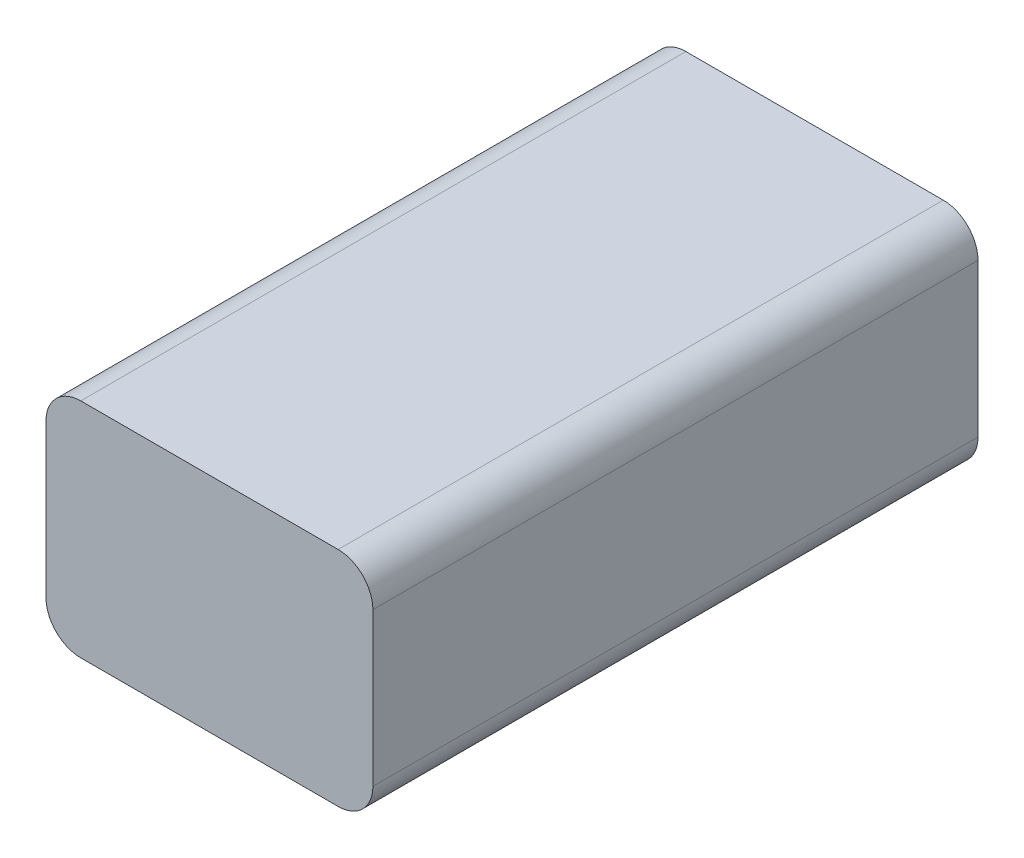
ISO-10303-21;
HEADER;
FILE_DESCRIPTION(('STEP AP214'),'2;1');
FILE_NAME('part.step','',(''),(''),'','','');
FILE_SCHEMA(('AUTOMOTIVE_DESIGN { 1 0 10303 214 1 1 1 1 }'));
ENDSEC;
DATA;
#1=APPLICATION_CONTEXT('core data for automotive mechanical design processes');
#2=APPLICATION_PROTOCOL_DEFINITION('international standard','automotive_design',2000,#1);
#3=PRODUCT_CONTEXT('',#1,'mechanical');
#4=PRODUCT('Part','Part','',(#3));
#5=PRODUCT_RELATED_PRODUCT_CATEGORY('part','',(#4));
#6=PRODUCT_DEFINITION_FORMATION('','',#4);
#7=PRODUCT_DEFINITION_CONTEXT('part definition',#1,'design');
#8=PRODUCT_DEFINITION('design','',#6,#7);
#9=PRODUCT_DEFINITION_SHAPE('','',#8);
#10=(LENGTH_UNIT() NAMED_UNIT(*) SI_UNIT(.MILLI.,.METRE.));
#11=(NAMED_UNIT(*) PLANE_ANGLE_UNIT() SI_UNIT($,.RADIAN.));
#12=(NAMED_UNIT(*) SI_UNIT($,.STERADIAN.) SOLID_ANGLE_UNIT());
#13=UNCERTAINTY_MEASURE_WITH_UNIT(LENGTH_MEASURE(1.E-05),#10,'distance_accuracy_value','');
#14=(GEOMETRIC_REPRESENTATION_CONTEXT(3) GLOBAL_UNCERTAINTY_ASSIGNED_CONTEXT((#13)) GLOBAL_UNIT_ASSIGNED_CONTEXT((#10,
#11,#12)) REPRESENTATION_CONTEXT('',''));
#15=CARTESIAN_POINT('',(0.,0.,0.));
#16=DIRECTION('',(0.,0.,1.));
#17=DIRECTION('',(1.,0.,0.));
#18=AXIS2_PLACEMENT_3D('',#15,#16,#17);
#19=CARTESIAN_POINT('',(-23.5,16.,87.));
#20=DIRECTION('',(1.,0.,0.));
#21=DIRECTION('',(0.,1.,0.));
#22=AXIS2_PLACEMENT_3D('',#19,#20,#21);
#23=PLANE('',#22);
#24=DIRECTION('',(0.,-1.,0.));
#25=VECTOR('',#24,1.);
#26=CARTESIAN_POINT('',(-23.5,16.,0.));
#27=LINE('',#26,#25);
#28=CARTESIAN_POINT('',(-23.5,11.,0.));
#29=VERTEX_POINT('',#28);
#30=CARTESIAN_POINT('',(-23.5,-11.,0.));
#31=VERTEX_POINT('',#30);
#32=EDGE_CURVE('E133',#29,#31,#27,.T.);
#33=ORIENTED_EDGE('',*,*,#32,.T.);
#34=DIRECTION('',(0.,0.,-1.));
#35=VECTOR('',#34,1.);
#36=CARTESIAN_POINT('',(-23.5,-11.,87.));
#37=LINE('',#36,#35);
#38=CARTESIAN_POINT('',(-23.5,-11.,87.));
#39=VERTEX_POINT('',#38);
#40=EDGE_CURVE('E110',#31,#39,#37,.F.);
#41=ORIENTED_EDGE('',*,*,#40,.T.);
#42=DIRECTION('',(0.,-1.,0.));
#43=VECTOR('',#42,1.);
#44=CARTESIAN_POINT('',(-23.5,16.,87.));
#45=LINE('',#44,#43);
#46=CARTESIAN_POINT('',(-23.5,11.,87.));
#47=VERTEX_POINT('',#46);
#48=EDGE_CURVE('E142',#47,#39,#45,.T.);
#49=ORIENTED_EDGE('',*,*,#48,.F.);
#50=DIRECTION('',(0.,0.,-1.));
#51=VECTOR('',#50,1.);
#52=CARTESIAN_POINT('',(-23.5,11.,87.));
#53=LINE('',#52,#51);
#54=EDGE_CURVE('E115',#47,#29,#53,.T.);
#55=ORIENTED_EDGE('',*,*,#54,.T.);
#56=EDGE_LOOP('',(#33,#41,#49,#55));
#57=FACE_BOUND('',#56,.T.);
#58=ADVANCED_FACE('F38',(#57),#23,.F.);
#59=CARTESIAN_POINT('',(23.5,-16.,87.));
#60=DIRECTION('',(0.,1.,0.));
#61=DIRECTION('',(-1.,0.,0.));
#62=AXIS2_PLACEMENT_3D('',#59,#60,#61);
#63=PLANE('',#62);
#64=DIRECTION('',(1.,0.,0.));
#65=VECTOR('',#64,1.);
#66=CARTESIAN_POINT('',(23.5,-16.,87.));
#67=LINE('',#66,#65);
#68=CARTESIAN_POINT('',(-18.5,-16.,87.));
#69=VERTEX_POINT('',#68);
#70=CARTESIAN_POINT('',(18.5,-16.,87.));
#71=VERTEX_POINT('',#70);
#72=EDGE_CURVE('E125',#69,#71,#67,.T.);
#73=ORIENTED_EDGE('',*,*,#72,.F.);
#74=DIRECTION('',(0.,0.,-1.));
#75=VECTOR('',#74,1.);
#76=CARTESIAN_POINT('',(-18.5,-16.,87.));
#77=LINE('',#76,#75);
#78=CARTESIAN_POINT('',(-18.5,-16.,0.));
#79=VERTEX_POINT('',#78);
#80=EDGE_CURVE('E109',#69,#79,#77,.T.);
#81=ORIENTED_EDGE('',*,*,#80,.T.);
#82=DIRECTION('',(1.,0.,0.));
#83=VECTOR('',#82,1.);
#84=CARTESIAN_POINT('',(23.5,-16.,0.));
#85=LINE('',#84,#83);
#86=CARTESIAN_POINT('',(18.5,-16.,0.));
#87=VERTEX_POINT('',#86);
#88=EDGE_CURVE('E122',#79,#87,#85,.T.);
#89=ORIENTED_EDGE('',*,*,#88,.T.);
#90=DIRECTION('',(0.,0.,-1.));
#91=VECTOR('',#90,1.);
#92=CARTESIAN_POINT('',(18.5,-16.,87.));
#93=LINE('',#92,#91);
#94=EDGE_CURVE('E127',#87,#71,#93,.F.);
#95=ORIENTED_EDGE('',*,*,#94,.T.);
#96=EDGE_LOOP('',(#73,#81,#89,#95));
#97=FACE_BOUND('',#96,.T.);
#98=ADVANCED_FACE('F121',(#97),#63,.F.);
#99=CARTESIAN_POINT('',(23.5,16.,87.));
#100=DIRECTION('',(-1.,0.,0.));
#101=DIRECTION('',(0.,-1.,0.));
#102=AXIS2_PLACEMENT_3D('',#99,#100,#101);
#103=PLANE('',#102);
#104=DIRECTION('',(0.,1.,0.));
#105=VECTOR('',#104,1.);
#106=CARTESIAN_POINT('',(23.5,16.,87.));
#107=LINE('',#106,#105);
#108=CARTESIAN_POINT('',(23.5,-11.,87.));
#109=VERTEX_POINT('',#108);
#110=CARTESIAN_POINT('',(23.5,11.,87.));
#111=VERTEX_POINT('',#110);
#112=EDGE_CURVE('E165',#109,#111,#107,.T.);
#113=ORIENTED_EDGE('',*,*,#112,.F.);
#114=DIRECTION('',(0.,0.,-1.));
#115=VECTOR('',#114,1.);
#116=CARTESIAN_POINT('',(23.5,-11.,87.));
#117=LINE('',#116,#115);
#118=CARTESIAN_POINT('',(23.5,-11.,0.));
#119=VERTEX_POINT('',#118);
#120=EDGE_CURVE('E11',#109,#119,#117,.T.);
#121=ORIENTED_EDGE('',*,*,#120,.T.);
#122=DIRECTION('',(0.,1.,0.));
#123=VECTOR('',#122,1.);
#124=CARTESIAN_POINT('',(23.5,16.,0.));
#125=LINE('',#124,#123);
#126=CARTESIAN_POINT('',(23.5,11.,0.));
#127=VERTEX_POINT('',#126);
#128=EDGE_CURVE('E132',#119,#127,#125,.T.);
#129=ORIENTED_EDGE('',*,*,#128,.T.);
#130=DIRECTION('',(0.,0.,-1.));
#131=VECTOR('',#130,1.);
#132=CARTESIAN_POINT('',(23.5,11.,87.));
#133=LINE('',#132,#131);
#134=EDGE_CURVE('E46',#127,#111,#133,.F.);
#135=ORIENTED_EDGE('',*,*,#134,.T.);
#136=EDGE_LOOP('',(#113,#121,#129,#135));
#137=FACE_BOUND('',#136,.T.);
#138=ADVANCED_FACE('F164',(#137),#103,.F.);
#139=CARTESIAN_POINT('',(23.5,16.,87.));
#140=DIRECTION('',(0.,-1.,0.));
#141=DIRECTION('',(1.,0.,0.));
#142=AXIS2_PLACEMENT_3D('',#139,#140,#141);
#143=PLANE('',#142);
#144=DIRECTION('',(-1.,0.,0.));
#145=VECTOR('',#144,1.);
#146=CARTESIAN_POINT('',(23.5,16.,0.));
#147=LINE('',#146,#145);
#148=CARTESIAN_POINT('',(18.5,16.,0.));
#149=VERTEX_POINT('',#148);
#150=CARTESIAN_POINT('',(-18.5,16.,0.));
#151=VERTEX_POINT('',#150);
#152=EDGE_CURVE('E136',#149,#151,#147,.T.);
#153=ORIENTED_EDGE('',*,*,#152,.T.);
#154=DIRECTION('',(0.,0.,-1.));
#155=VECTOR('',#154,1.);
#156=CARTESIAN_POINT('',(-18.5,16.,87.));
#157=LINE('',#156,#155);
#158=CARTESIAN_POINT('',(-18.5,16.,87.));
#159=VERTEX_POINT('',#158);
#160=EDGE_CURVE('E53',#151,#159,#157,.F.);
#161=ORIENTED_EDGE('',*,*,#160,.T.);
#162=DIRECTION('',(-1.,0.,0.));
#163=VECTOR('',#162,1.);
#164=CARTESIAN_POINT('',(23.5,16.,87.));
#165=LINE('',#164,#163);
#166=CARTESIAN_POINT('',(18.5,16.,87.));
#167=VERTEX_POINT('',#166);
#168=EDGE_CURVE('E143',#167,#159,#165,.T.);
#169=ORIENTED_EDGE('',*,*,#168,.F.);
#170=DIRECTION('',(0.,0.,-1.));
#171=VECTOR('',#170,1.);
#172=CARTESIAN_POINT('',(18.5,16.,87.));
#173=LINE('',#172,#171);
#174=EDGE_CURVE('E158',#167,#149,#173,.T.);
#175=ORIENTED_EDGE('',*,*,#174,.T.);
#176=EDGE_LOOP('',(#153,#161,#169,#175));
#177=FACE_BOUND('',#176,.T.);
#178=ADVANCED_FACE('F174',(#177),#143,.F.);
#179=CARTESIAN_POINT('',(0.,0.,87.));
#180=DIRECTION('',(0.,0.,-1.));
#181=DIRECTION('',(-1.,0.,0.));
#182=AXIS2_PLACEMENT_3D('',#179,#180,#181);
#183=PLANE('',#182);
#184=ORIENTED_EDGE('',*,*,#48,.T.);
#185=CARTESIAN_POINT('',(-18.5,-11.,87.));
#186=DIRECTION('',(0.,0.,-1.));
#187=DIRECTION('',(-1.,0.,0.));
#188=AXIS2_PLACEMENT_3D('',#185,#186,#187);
#189=CIRCLE('',#188,5.);
#190=EDGE_CURVE('E156',#39,#69,#189,.F.);
#191=ORIENTED_EDGE('',*,*,#190,.T.);
#192=ORIENTED_EDGE('',*,*,#72,.T.);
#193=CARTESIAN_POINT('',(18.5,-11.,87.));
#194=DIRECTION('',(0.,0.,-1.));
#195=DIRECTION('',(-1.,0.,0.));
#196=AXIS2_PLACEMENT_3D('',#193,#194,#195);
#197=CIRCLE('',#196,5.);
#198=EDGE_CURVE('E152',#71,#109,#197,.F.);
#199=ORIENTED_EDGE('',*,*,#198,.T.);
#200=ORIENTED_EDGE('',*,*,#112,.T.);
#201=CARTESIAN_POINT('',(18.5,11.,87.));
#202=DIRECTION('',(0.,0.,-1.));
#203=DIRECTION('',(-1.,0.,0.));
#204=AXIS2_PLACEMENT_3D('',#201,#202,#203);
#205=CIRCLE('',#204,5.);
#206=EDGE_CURVE('E60',#111,#167,#205,.F.);
#207=ORIENTED_EDGE('',*,*,#206,.T.);
#208=ORIENTED_EDGE('',*,*,#168,.T.);
#209=CARTESIAN_POINT('',(-18.5,11.,87.));
#210=DIRECTION('',(0.,0.,-1.));
#211=DIRECTION('',(-1.,0.,0.));
#212=AXIS2_PLACEMENT_3D('',#209,#210,#211);
#213=CIRCLE('',#212,5.);
#214=EDGE_CURVE('E154',#159,#47,#213,.F.);
#215=ORIENTED_EDGE('',*,*,#214,.T.);
#216=EDGE_LOOP('',(#184,#191,#192,#199,#200,#207,#208,#215));
#217=FACE_BOUND('',#216,.T.);
#218=ADVANCED_FACE('F169',(#217),#183,.F.);
#219=CARTESIAN_POINT('',(0.,0.,0.));
#220=DIRECTION('',(0.,0.,-1.));
#221=DIRECTION('',(-1.,0.,0.));
#222=AXIS2_PLACEMENT_3D('',#219,#220,#221);
#223=PLANE('',#222);
#224=ORIENTED_EDGE('',*,*,#88,.F.);
#225=CARTESIAN_POINT('',(-18.5,-11.,0.));
#226=DIRECTION('',(0.,0.,-1.));
#227=DIRECTION('',(-1.,0.,0.));
#228=AXIS2_PLACEMENT_3D('',#225,#226,#227);
#229=CIRCLE('',#228,5.);
#230=EDGE_CURVE('E105',#79,#31,#229,.T.);
#231=ORIENTED_EDGE('',*,*,#230,.T.);
#232=ORIENTED_EDGE('',*,*,#32,.F.);
#233=CARTESIAN_POINT('',(-18.5,11.,0.));
#234=DIRECTION('',(0.,0.,-1.));
#235=DIRECTION('',(-1.,0.,0.));
#236=AXIS2_PLACEMENT_3D('',#233,#234,#235);
#237=CIRCLE('',#236,5.);
#238=EDGE_CURVE('E116',#29,#151,#237,.T.);
#239=ORIENTED_EDGE('',*,*,#238,.T.);
#240=ORIENTED_EDGE('',*,*,#152,.F.);
#241=CARTESIAN_POINT('',(18.5,11.,0.));
#242=DIRECTION('',(0.,0.,-1.));
#243=DIRECTION('',(-1.,0.,0.));
#244=AXIS2_PLACEMENT_3D('',#241,#242,#243);
#245=CIRCLE('',#244,5.);
#246=EDGE_CURVE('E126',#149,#127,#245,.T.);
#247=ORIENTED_EDGE('',*,*,#246,.T.);
#248=ORIENTED_EDGE('',*,*,#128,.F.);
#249=CARTESIAN_POINT('',(18.5,-11.,0.));
#250=DIRECTION('',(0.,0.,-1.));
#251=DIRECTION('',(-1.,0.,0.));
#252=AXIS2_PLACEMENT_3D('',#249,#250,#251);
#253=CIRCLE('',#252,5.);
#254=EDGE_CURVE('E131',#119,#87,#253,.T.);
#255=ORIENTED_EDGE('',*,*,#254,.T.);
#256=EDGE_LOOP('',(#224,#231,#232,#239,#240,#247,#248,#255));
#257=FACE_BOUND('',#256,.T.);
#258=ADVANCED_FACE('F129',(#257),#223,.T.);
#259=CARTESIAN_POINT('',(-18.5,-11.,87.));
#260=DIRECTION('',(0.,0.,-1.));
#261=DIRECTION('',(-1.,0.,0.));
#262=AXIS2_PLACEMENT_3D('',#259,#260,#261);
#263=CYLINDRICAL_SURFACE('',#262,5.);
#264=ORIENTED_EDGE('',*,*,#190,.F.);
#265=ORIENTED_EDGE('',*,*,#40,.F.);
#266=ORIENTED_EDGE('',*,*,#230,.F.);
#267=ORIENTED_EDGE('',*,*,#80,.F.);
#268=EDGE_LOOP('',(#264,#265,#266,#267));
#269=FACE_BOUND('',#268,.T.);
#270=ADVANCED_FACE('F108',(#269),#263,.T.);
#271=CARTESIAN_POINT('',(-18.5,11.,87.));
#272=DIRECTION('',(0.,0.,-1.));
#273=DIRECTION('',(-1.,0.,0.));
#274=AXIS2_PLACEMENT_3D('',#271,#272,#273);
#275=CYLINDRICAL_SURFACE('',#274,5.);
#276=ORIENTED_EDGE('',*,*,#214,.F.);
#277=ORIENTED_EDGE('',*,*,#160,.F.);
#278=ORIENTED_EDGE('',*,*,#238,.F.);
#279=ORIENTED_EDGE('',*,*,#54,.F.);
#280=EDGE_LOOP('',(#276,#277,#278,#279));
#281=FACE_BOUND('',#280,.T.);
#282=ADVANCED_FACE('F178',(#281),#275,.T.);
#283=CARTESIAN_POINT('',(18.5,-11.,87.));
#284=DIRECTION('',(0.,0.,-1.));
#285=DIRECTION('',(-1.,0.,0.));
#286=AXIS2_PLACEMENT_3D('',#283,#284,#285);
#287=CYLINDRICAL_SURFACE('',#286,5.);
#288=ORIENTED_EDGE('',*,*,#198,.F.);
#289=ORIENTED_EDGE('',*,*,#94,.F.);
#290=ORIENTED_EDGE('',*,*,#254,.F.);
#291=ORIENTED_EDGE('',*,*,#120,.F.);
#292=EDGE_LOOP('',(#288,#289,#290,#291));
#293=FACE_BOUND('',#292,.T.);
#294=ADVANCED_FACE('F184',(#293),#287,.T.);
#295=CARTESIAN_POINT('',(18.5,11.,87.));
#296=DIRECTION('',(0.,0.,-1.));
#297=DIRECTION('',(-1.,0.,0.));
#298=AXIS2_PLACEMENT_3D('',#295,#296,#297);
#299=CYLINDRICAL_SURFACE('',#298,5.);
#300=ORIENTED_EDGE('',*,*,#206,.F.);
#301=ORIENTED_EDGE('',*,*,#134,.F.);
#302=ORIENTED_EDGE('',*,*,#246,.F.);
#303=ORIENTED_EDGE('',*,*,#174,.F.);
#304=EDGE_LOOP('',(#300,#301,#302,#303));
#305=FACE_BOUND('',#304,.T.);
#306=ADVANCED_FACE('F40',(#305),#299,.T.);
#307=CLOSED_SHELL('',(#58,#98,#138,#178,#218,#258,#270,#282,#294,#306));
#308=MANIFOLD_SOLID_BREP('B2',#307);
#309=ADVANCED_BREP_SHAPE_REPRESENTATION('',(#18,#308),#14);
#310=SHAPE_DEFINITION_REPRESENTATION(#9,#309);
ENDSEC;
END-ISO-10303-21;
